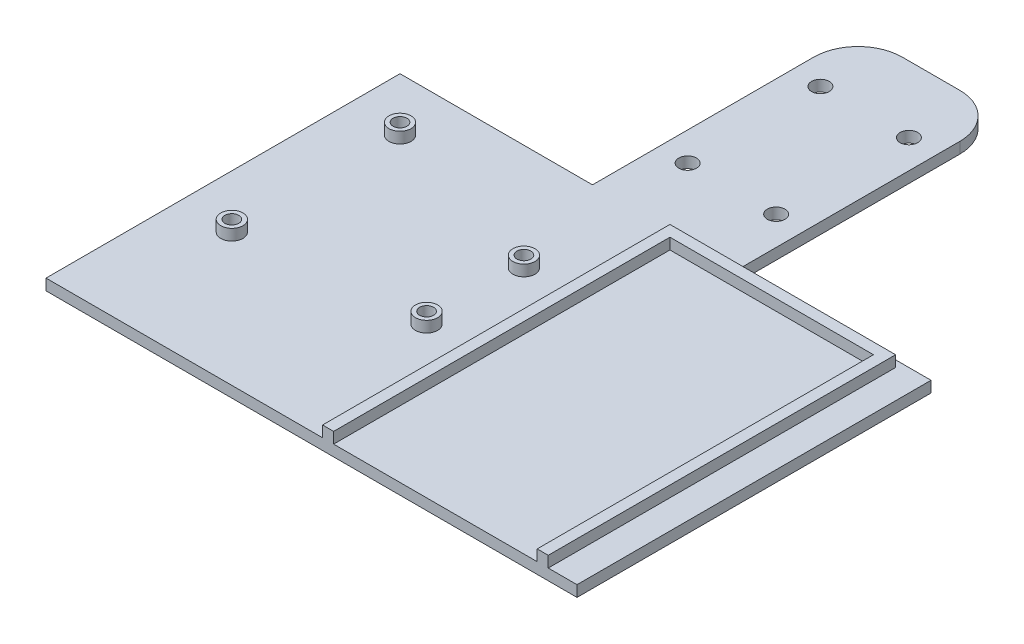
ISO-10303-21;
HEADER;
FILE_DESCRIPTION(('STEP AP214'),'2;1');
FILE_NAME('part.step','',(''),(''),'','','');
FILE_SCHEMA(('AUTOMOTIVE_DESIGN { 1 0 10303 214 1 1 1 1 }'));
ENDSEC;
DATA;
#1=APPLICATION_CONTEXT('core data for automotive mechanical design processes');
#2=APPLICATION_PROTOCOL_DEFINITION('international standard','automotive_design',2000,#1);
#3=PRODUCT_CONTEXT('',#1,'mechanical');
#4=PRODUCT('Part','Part','',(#3));
#5=PRODUCT_RELATED_PRODUCT_CATEGORY('part','',(#4));
#6=PRODUCT_DEFINITION_FORMATION('','',#4);
#7=PRODUCT_DEFINITION_CONTEXT('part definition',#1,'design');
#8=PRODUCT_DEFINITION('design','',#6,#7);
#9=PRODUCT_DEFINITION_SHAPE('','',#8);
#10=(LENGTH_UNIT() NAMED_UNIT(*) SI_UNIT(.MILLI.,.METRE.));
#11=(NAMED_UNIT(*) PLANE_ANGLE_UNIT() SI_UNIT($,.RADIAN.));
#12=(NAMED_UNIT(*) SI_UNIT($,.STERADIAN.) SOLID_ANGLE_UNIT());
#13=UNCERTAINTY_MEASURE_WITH_UNIT(LENGTH_MEASURE(1.E-05),#10,'distance_accuracy_value','');
#14=(GEOMETRIC_REPRESENTATION_CONTEXT(3) GLOBAL_UNCERTAINTY_ASSIGNED_CONTEXT((#13)) GLOBAL_UNIT_ASSIGNED_CONTEXT((#10,
#11,#12)) REPRESENTATION_CONTEXT('',''));
#15=CARTESIAN_POINT('',(0.,0.,0.));
#16=DIRECTION('',(0.,0.,1.));
#17=DIRECTION('',(1.,0.,0.));
#18=AXIS2_PLACEMENT_3D('',#15,#16,#17);
#19=CARTESIAN_POINT('',(0.,3.175,0.));
#20=DIRECTION('',(0.,-1.,0.));
#21=DIRECTION('',(0.,0.,-1.));
#22=AXIS2_PLACEMENT_3D('',#19,#20,#21);
#23=PLANE('',#22);
#24=CARTESIAN_POINT('',(-60.96,3.175,101.6));
#25=DIRECTION('',(0.,-1.,0.));
#26=DIRECTION('',(0.,0.,-1.));
#27=AXIS2_PLACEMENT_3D('',#24,#25,#26);
#28=CIRCLE('',#27,3.175);
#29=CARTESIAN_POINT('',(-60.96,3.175,98.425));
#30=VERTEX_POINT('',#29);
#31=EDGE_CURVE('E395',#30,#30,#28,.F.);
#32=ORIENTED_EDGE('',*,*,#31,.F.);
#33=EDGE_LOOP('',(#32));
#34=FACE_BOUND('',#33,.T.);
#35=CARTESIAN_POINT('',(-10.16,3.175,68.58));
#36=DIRECTION('',(0.,-1.,0.));
#37=DIRECTION('',(0.,0.,-1.));
#38=AXIS2_PLACEMENT_3D('',#35,#36,#37);
#39=CIRCLE('',#38,3.175);
#40=CARTESIAN_POINT('',(-10.16,3.175,65.405));
#41=VERTEX_POINT('',#40);
#42=EDGE_CURVE('E387',#41,#41,#39,.F.);
#43=ORIENTED_EDGE('',*,*,#42,.F.);
#44=EDGE_LOOP('',(#43));
#45=FACE_BOUND('',#44,.T.);
#46=CARTESIAN_POINT('',(12.7,3.175,-19.05));
#47=DIRECTION('',(0.,1.,0.));
#48=DIRECTION('',(0.,0.,1.));
#49=AXIS2_PLACEMENT_3D('',#46,#47,#48);
#50=CIRCLE('',#49,2.54);
#51=CARTESIAN_POINT('',(12.7,3.175,-16.51));
#52=VERTEX_POINT('',#51);
#53=EDGE_CURVE('E331',#52,#52,#50,.T.);
#54=ORIENTED_EDGE('',*,*,#53,.F.);
#55=EDGE_LOOP('',(#54));
#56=FACE_BOUND('',#55,.T.);
#57=CARTESIAN_POINT('',(12.7,3.175,19.05));
#58=DIRECTION('',(0.,1.,0.));
#59=DIRECTION('',(0.,0.,1.));
#60=AXIS2_PLACEMENT_3D('',#57,#58,#59);
#61=CIRCLE('',#60,2.54);
#62=CARTESIAN_POINT('',(12.7,3.175,21.59));
#63=VERTEX_POINT('',#62);
#64=EDGE_CURVE('E339',#63,#63,#61,.T.);
#65=ORIENTED_EDGE('',*,*,#64,.F.);
#66=EDGE_LOOP('',(#65));
#67=FACE_BOUND('',#66,.T.);
#68=CARTESIAN_POINT('',(-12.7,3.175,19.05));
#69=DIRECTION('',(0.,1.,0.));
#70=DIRECTION('',(0.,0.,1.));
#71=AXIS2_PLACEMENT_3D('',#68,#69,#70);
#72=CIRCLE('',#71,2.54);
#73=CARTESIAN_POINT('',(-12.7,3.175,21.59));
#74=VERTEX_POINT('',#73);
#75=EDGE_CURVE('E347',#74,#74,#72,.T.);
#76=ORIENTED_EDGE('',*,*,#75,.F.);
#77=EDGE_LOOP('',(#76));
#78=FACE_BOUND('',#77,.T.);
#79=CARTESIAN_POINT('',(-12.7,3.175,-19.05));
#80=DIRECTION('',(0.,1.,0.));
#81=DIRECTION('',(0.,0.,1.));
#82=AXIS2_PLACEMENT_3D('',#79,#80,#81);
#83=CIRCLE('',#82,2.54);
#84=CARTESIAN_POINT('',(-12.7,3.175,-16.51));
#85=VERTEX_POINT('',#84);
#86=EDGE_CURVE('E355',#85,#85,#83,.T.);
#87=ORIENTED_EDGE('',*,*,#86,.F.);
#88=EDGE_LOOP('',(#87));
#89=FACE_BOUND('',#88,.T.);
#90=DIRECTION('',(-1.,0.,0.));
#91=VECTOR('',#90,1.);
#92=CARTESIAN_POINT('',(-20.955,3.175,-38.1));
#93=LINE('',#92,#91);
#94=CARTESIAN_POINT('',(8.255,3.175,-38.1));
#95=VERTEX_POINT('',#94);
#96=CARTESIAN_POINT('',(-8.255,3.175,-38.1));
#97=VERTEX_POINT('',#96);
#98=EDGE_CURVE('E366',#95,#97,#93,.T.);
#99=ORIENTED_EDGE('',*,*,#98,.T.);
#100=CARTESIAN_POINT('',(-8.255,3.175,-25.4));
#101=DIRECTION('',(0.,-1.,0.));
#102=DIRECTION('',(0.,0.,-1.));
#103=AXIS2_PLACEMENT_3D('',#100,#101,#102);
#104=CIRCLE('',#103,12.7);
#105=CARTESIAN_POINT('',(-20.955,3.175,-25.4));
#106=VERTEX_POINT('',#105);
#107=EDGE_CURVE('E54',#97,#106,#104,.F.);
#108=ORIENTED_EDGE('',*,*,#107,.T.);
#109=DIRECTION('',(0.,0.,1.));
#110=VECTOR('',#109,1.);
#111=CARTESIAN_POINT('',(-20.955,3.175,38.1));
#112=LINE('',#111,#110);
#113=CARTESIAN_POINT('',(-20.955,3.175,38.1));
#114=VERTEX_POINT('',#113);
#115=EDGE_CURVE('E370',#106,#114,#112,.T.);
#116=ORIENTED_EDGE('',*,*,#115,.T.);
#117=DIRECTION('',(-1.,0.,0.));
#118=VECTOR('',#117,1.);
#119=CARTESIAN_POINT('',(-76.2,3.175,38.1));
#120=LINE('',#119,#118);
#121=CARTESIAN_POINT('',(-76.2,3.175,38.1));
#122=VERTEX_POINT('',#121);
#123=EDGE_CURVE('E296',#114,#122,#120,.T.);
#124=ORIENTED_EDGE('',*,*,#123,.T.);
#125=DIRECTION('',(0.,0.,1.));
#126=VECTOR('',#125,1.);
#127=CARTESIAN_POINT('',(-76.2,3.175,139.7));
#128=LINE('',#127,#126);
#129=CARTESIAN_POINT('',(-76.2,3.175,139.7));
#130=VERTEX_POINT('',#129);
#131=EDGE_CURVE('E288',#122,#130,#128,.T.);
#132=ORIENTED_EDGE('',*,*,#131,.T.);
#133=DIRECTION('',(1.,0.,0.));
#134=VECTOR('',#133,1.);
#135=CARTESIAN_POINT('',(-76.2,3.175,139.7));
#136=LINE('',#135,#134);
#137=CARTESIAN_POINT('',(3.17499999999998,3.175,139.7));
#138=VERTEX_POINT('',#137);
#139=EDGE_CURVE('E282',#130,#138,#136,.T.);
#140=ORIENTED_EDGE('',*,*,#139,.T.);
#141=DIRECTION('',(0.,0.,1.));
#142=VECTOR('',#141,1.);
#143=CARTESIAN_POINT('',(3.17500000000002,3.175,120.65));
#144=LINE('',#143,#142);
#145=CARTESIAN_POINT('',(3.17500000000001,3.175,40.005));
#146=VERTEX_POINT('',#145);
#147=EDGE_CURVE('E183',#146,#138,#144,.T.);
#148=ORIENTED_EDGE('',*,*,#147,.F.);
#149=DIRECTION('',(-1.,0.,0.));
#150=VECTOR('',#149,1.);
#151=CARTESIAN_POINT('',(3.17500000000001,3.175,40.005));
#152=LINE('',#151,#150);
#153=CARTESIAN_POINT('',(67.945,3.175,40.005));
#154=VERTEX_POINT('',#153);
#155=EDGE_CURVE('E235',#154,#146,#152,.T.);
#156=ORIENTED_EDGE('',*,*,#155,.F.);
#157=DIRECTION('',(0.,0.,-1.));
#158=VECTOR('',#157,1.);
#159=CARTESIAN_POINT('',(67.945,3.175,40.005));
#160=LINE('',#159,#158);
#161=CARTESIAN_POINT('',(67.945,3.175,139.7));
#162=VERTEX_POINT('',#161);
#163=EDGE_CURVE('E231',#162,#154,#160,.T.);
#164=ORIENTED_EDGE('',*,*,#163,.F.);
#165=CARTESIAN_POINT('',(76.2,3.175,139.7));
#166=VERTEX_POINT('',#165);
#167=EDGE_CURVE('E287',#162,#166,#136,.T.);
#168=ORIENTED_EDGE('',*,*,#167,.T.);
#169=DIRECTION('',(0.,0.,-1.));
#170=VECTOR('',#169,1.);
#171=CARTESIAN_POINT('',(76.2,3.175,139.7));
#172=LINE('',#171,#170);
#173=CARTESIAN_POINT('',(76.2,3.175,38.1));
#174=VERTEX_POINT('',#173);
#175=EDGE_CURVE('E270',#166,#174,#172,.T.);
#176=ORIENTED_EDGE('',*,*,#175,.T.);
#177=CARTESIAN_POINT('',(20.955,3.175,38.1));
#178=VERTEX_POINT('',#177);
#179=EDGE_CURVE('E292',#174,#178,#120,.T.);
#180=ORIENTED_EDGE('',*,*,#179,.T.);
#181=DIRECTION('',(0.,0.,-1.));
#182=VECTOR('',#181,1.);
#183=CARTESIAN_POINT('',(20.955,3.175,38.1));
#184=LINE('',#183,#182);
#185=CARTESIAN_POINT('',(20.955,3.175,-25.4));
#186=VERTEX_POINT('',#185);
#187=EDGE_CURVE('E363',#178,#186,#184,.T.);
#188=ORIENTED_EDGE('',*,*,#187,.T.);
#189=CARTESIAN_POINT('',(8.255,3.175,-25.4));
#190=DIRECTION('',(0.,-1.,0.));
#191=DIRECTION('',(0.,0.,-1.));
#192=AXIS2_PLACEMENT_3D('',#189,#190,#191);
#193=CIRCLE('',#192,12.7);
#194=EDGE_CURVE('E419',#186,#95,#193,.F.);
#195=ORIENTED_EDGE('',*,*,#194,.T.);
#196=EDGE_LOOP('',(#99,#108,#116,#124,#132,#140,#148,#156,#164,#168,#176,#180,#188,#195));
#197=FACE_BOUND('',#196,.T.);
#198=CARTESIAN_POINT('',(-10.16,3.175,96.52));
#199=DIRECTION('',(0.,-1.,0.));
#200=DIRECTION('',(0.,0.,-1.));
#201=AXIS2_PLACEMENT_3D('',#198,#199,#200);
#202=CIRCLE('',#201,3.175);
#203=CARTESIAN_POINT('',(-10.16,3.175,93.345));
#204=VERTEX_POINT('',#203);
#205=EDGE_CURVE('E391',#204,#204,#202,.F.);
#206=ORIENTED_EDGE('',*,*,#205,.F.);
#207=EDGE_LOOP('',(#206));
#208=FACE_BOUND('',#207,.T.);
#209=CARTESIAN_POINT('',(-60.96,3.175,53.34));
#210=DIRECTION('',(0.,-1.,0.));
#211=DIRECTION('',(0.,0.,-1.));
#212=AXIS2_PLACEMENT_3D('',#209,#210,#211);
#213=CIRCLE('',#212,3.175);
#214=CARTESIAN_POINT('',(-60.96,3.175,50.165));
#215=VERTEX_POINT('',#214);
#216=EDGE_CURVE('E399',#215,#215,#213,.F.);
#217=ORIENTED_EDGE('',*,*,#216,.F.);
#218=EDGE_LOOP('',(#217));
#219=FACE_BOUND('',#218,.T.);
#220=ADVANCED_FACE('F45',(#34,#45,#56,#67,#78,#89,#197,#208,#219),#23,.F.);
#221=DIRECTION('',(0.,0.,-1.));
#222=VECTOR('',#221,1.);
#223=CARTESIAN_POINT('',(6.35000000000001,3.175,43.18));
#224=LINE('',#223,#222);
#225=CARTESIAN_POINT('',(6.34999999999998,3.175,139.7));
#226=VERTEX_POINT('',#225);
#227=CARTESIAN_POINT('',(6.35000000000001,3.175,43.18));
#228=VERTEX_POINT('',#227);
#229=EDGE_CURVE('E189',#226,#228,#224,.T.);
#230=ORIENTED_EDGE('',*,*,#229,.F.);
#231=CARTESIAN_POINT('',(64.7699999999999,3.175,139.7));
#232=VERTEX_POINT('',#231);
#233=EDGE_CURVE('E286',#226,#232,#136,.T.);
#234=ORIENTED_EDGE('',*,*,#233,.T.);
#235=DIRECTION('',(0.,0.,1.));
#236=VECTOR('',#235,1.);
#237=CARTESIAN_POINT('',(64.77,3.175,120.65));
#238=LINE('',#237,#236);
#239=CARTESIAN_POINT('',(64.77,3.175,43.18));
#240=VERTEX_POINT('',#239);
#241=EDGE_CURVE('E227',#240,#232,#238,.T.);
#242=ORIENTED_EDGE('',*,*,#241,.F.);
#243=DIRECTION('',(1.,0.,0.));
#244=VECTOR('',#243,1.);
#245=CARTESIAN_POINT('',(6.35000000000001,3.175,43.18));
#246=LINE('',#245,#244);
#247=EDGE_CURVE('E223',#228,#240,#246,.T.);
#248=ORIENTED_EDGE('',*,*,#247,.F.);
#249=EDGE_LOOP('',(#230,#234,#242,#248));
#250=FACE_BOUND('',#249,.T.);
#251=ADVANCED_FACE('F479',(#250),#23,.F.);
#252=CARTESIAN_POINT('',(0.,0.,0.));
#253=DIRECTION('',(0.,-1.,0.));
#254=DIRECTION('',(0.,0.,-1.));
#255=AXIS2_PLACEMENT_3D('',#252,#253,#254);
#256=PLANE('',#255);
#257=CARTESIAN_POINT('',(-60.96,0.,53.34));
#258=DIRECTION('',(0.,1.,0.));
#259=DIRECTION('',(0.,0.,1.));
#260=AXIS2_PLACEMENT_3D('',#257,#258,#259);
#261=CIRCLE('',#260,2.00000000000001);
#262=CARTESIAN_POINT('',(-60.96,0.,55.34));
#263=VERTEX_POINT('',#262);
#264=EDGE_CURVE('E266',#263,#263,#261,.T.);
#265=ORIENTED_EDGE('',*,*,#264,.T.);
#266=EDGE_LOOP('',(#265));
#267=FACE_BOUND('',#266,.T.);
#268=CARTESIAN_POINT('',(-60.96,0.,101.6));
#269=DIRECTION('',(0.,1.,0.));
#270=DIRECTION('',(0.,0.,1.));
#271=AXIS2_PLACEMENT_3D('',#268,#269,#270);
#272=CIRCLE('',#271,2.00000000000001);
#273=CARTESIAN_POINT('',(-60.96,0.,103.6));
#274=VERTEX_POINT('',#273);
#275=EDGE_CURVE('E271',#274,#274,#272,.T.);
#276=ORIENTED_EDGE('',*,*,#275,.T.);
#277=EDGE_LOOP('',(#276));
#278=FACE_BOUND('',#277,.T.);
#279=CARTESIAN_POINT('',(-10.16,0.,96.52));
#280=DIRECTION('',(0.,1.,0.));
#281=DIRECTION('',(0.,0.,1.));
#282=AXIS2_PLACEMENT_3D('',#279,#280,#281);
#283=CIRCLE('',#282,2.);
#284=CARTESIAN_POINT('',(-10.16,0.,98.52));
#285=VERTEX_POINT('',#284);
#286=EDGE_CURVE('E275',#285,#285,#283,.T.);
#287=ORIENTED_EDGE('',*,*,#286,.T.);
#288=EDGE_LOOP('',(#287));
#289=FACE_BOUND('',#288,.T.);
#290=CARTESIAN_POINT('',(-10.16,0.,68.58));
#291=DIRECTION('',(0.,1.,0.));
#292=DIRECTION('',(0.,0.,1.));
#293=AXIS2_PLACEMENT_3D('',#290,#291,#292);
#294=CIRCLE('',#293,2.);
#295=CARTESIAN_POINT('',(-10.16,0.,70.58));
#296=VERTEX_POINT('',#295);
#297=EDGE_CURVE('E193',#296,#296,#294,.T.);
#298=ORIENTED_EDGE('',*,*,#297,.T.);
#299=EDGE_LOOP('',(#298));
#300=FACE_BOUND('',#299,.T.);
#301=CARTESIAN_POINT('',(12.7,0.,19.05));
#302=DIRECTION('',(0.,1.,0.));
#303=DIRECTION('',(0.,0.,1.));
#304=AXIS2_PLACEMENT_3D('',#301,#302,#303);
#305=CIRCLE('',#304,2.54);
#306=CARTESIAN_POINT('',(12.7,0.,21.59));
#307=VERTEX_POINT('',#306);
#308=EDGE_CURVE('E335',#307,#307,#305,.T.);
#309=ORIENTED_EDGE('',*,*,#308,.T.);
#310=EDGE_LOOP('',(#309));
#311=FACE_BOUND('',#310,.T.);
#312=CARTESIAN_POINT('',(-12.7,0.,-19.05));
#313=DIRECTION('',(0.,1.,0.));
#314=DIRECTION('',(0.,0.,1.));
#315=AXIS2_PLACEMENT_3D('',#312,#313,#314);
#316=CIRCLE('',#315,2.54);
#317=CARTESIAN_POINT('',(-12.7,0.,-16.51));
#318=VERTEX_POINT('',#317);
#319=EDGE_CURVE('E351',#318,#318,#316,.T.);
#320=ORIENTED_EDGE('',*,*,#319,.T.);
#321=EDGE_LOOP('',(#320));
#322=FACE_BOUND('',#321,.T.);
#323=DIRECTION('',(0.,0.,1.));
#324=VECTOR('',#323,1.);
#325=CARTESIAN_POINT('',(-20.955,0.,38.1));
#326=LINE('',#325,#324);
#327=CARTESIAN_POINT('',(-20.955,0.,-25.4));
#328=VERTEX_POINT('',#327);
#329=CARTESIAN_POINT('',(-20.955,0.,38.1));
#330=VERTEX_POINT('',#329);
#331=EDGE_CURVE('E367',#328,#330,#326,.T.);
#332=ORIENTED_EDGE('',*,*,#331,.F.);
#333=CARTESIAN_POINT('',(-8.255,0.,-25.4));
#334=DIRECTION('',(0.,-1.,0.));
#335=DIRECTION('',(0.,0.,-1.));
#336=AXIS2_PLACEMENT_3D('',#333,#334,#335);
#337=CIRCLE('',#336,12.7);
#338=CARTESIAN_POINT('',(-8.255,0.,-38.1));
#339=VERTEX_POINT('',#338);
#340=EDGE_CURVE('E410',#328,#339,#337,.T.);
#341=ORIENTED_EDGE('',*,*,#340,.T.);
#342=DIRECTION('',(-1.,0.,0.));
#343=VECTOR('',#342,1.);
#344=CARTESIAN_POINT('',(-20.955,0.,-38.1));
#345=LINE('',#344,#343);
#346=CARTESIAN_POINT('',(8.255,0.,-38.1));
#347=VERTEX_POINT('',#346);
#348=EDGE_CURVE('E376',#347,#339,#345,.T.);
#349=ORIENTED_EDGE('',*,*,#348,.F.);
#350=CARTESIAN_POINT('',(8.255,0.,-25.4));
#351=DIRECTION('',(0.,-1.,0.));
#352=DIRECTION('',(0.,0.,-1.));
#353=AXIS2_PLACEMENT_3D('',#350,#351,#352);
#354=CIRCLE('',#353,12.7);
#355=CARTESIAN_POINT('',(20.955,0.,-25.4));
#356=VERTEX_POINT('',#355);
#357=EDGE_CURVE('E407',#347,#356,#354,.T.);
#358=ORIENTED_EDGE('',*,*,#357,.T.);
#359=DIRECTION('',(0.,0.,-1.));
#360=VECTOR('',#359,1.);
#361=CARTESIAN_POINT('',(20.955,0.,38.1));
#362=LINE('',#361,#360);
#363=CARTESIAN_POINT('',(20.955,0.,38.1));
#364=VERTEX_POINT('',#363);
#365=EDGE_CURVE('E359',#364,#356,#362,.T.);
#366=ORIENTED_EDGE('',*,*,#365,.F.);
#367=DIRECTION('',(-1.,0.,0.));
#368=VECTOR('',#367,1.);
#369=CARTESIAN_POINT('',(-76.2,0.,38.1));
#370=LINE('',#369,#368);
#371=CARTESIAN_POINT('',(76.2,0.,38.1));
#372=VERTEX_POINT('',#371);
#373=EDGE_CURVE('E300',#372,#364,#370,.T.);
#374=ORIENTED_EDGE('',*,*,#373,.F.);
#375=DIRECTION('',(0.,0.,-1.));
#376=VECTOR('',#375,1.);
#377=CARTESIAN_POINT('',(76.2,0.,139.7));
#378=LINE('',#377,#376);
#379=CARTESIAN_POINT('',(76.2,0.,139.7));
#380=VERTEX_POINT('',#379);
#381=EDGE_CURVE('E305',#380,#372,#378,.T.);
#382=ORIENTED_EDGE('',*,*,#381,.F.);
#383=DIRECTION('',(1.,0.,0.));
#384=VECTOR('',#383,1.);
#385=CARTESIAN_POINT('',(-76.2,0.,139.7));
#386=LINE('',#385,#384);
#387=CARTESIAN_POINT('',(-76.2,0.,139.7));
#388=VERTEX_POINT('',#387);
#389=EDGE_CURVE('E311',#388,#380,#386,.T.);
#390=ORIENTED_EDGE('',*,*,#389,.F.);
#391=DIRECTION('',(0.,0.,1.));
#392=VECTOR('',#391,1.);
#393=CARTESIAN_POINT('',(-76.2,0.,139.7));
#394=LINE('',#393,#392);
#395=CARTESIAN_POINT('',(-76.2,0.,38.1));
#396=VERTEX_POINT('',#395);
#397=EDGE_CURVE('E316',#396,#388,#394,.T.);
#398=ORIENTED_EDGE('',*,*,#397,.F.);
#399=EDGE_CURVE('E285',#330,#396,#370,.T.);
#400=ORIENTED_EDGE('',*,*,#399,.F.);
#401=EDGE_LOOP('',(#332,#341,#349,#358,#366,#374,#382,#390,#398,#400));
#402=FACE_BOUND('',#401,.T.);
#403=CARTESIAN_POINT('',(-12.7,0.,19.05));
#404=DIRECTION('',(0.,1.,0.));
#405=DIRECTION('',(0.,0.,1.));
#406=AXIS2_PLACEMENT_3D('',#403,#404,#405);
#407=CIRCLE('',#406,2.54);
#408=CARTESIAN_POINT('',(-12.7,0.,21.59));
#409=VERTEX_POINT('',#408);
#410=EDGE_CURVE('E343',#409,#409,#407,.T.);
#411=ORIENTED_EDGE('',*,*,#410,.T.);
#412=EDGE_LOOP('',(#411));
#413=FACE_BOUND('',#412,.T.);
#414=CARTESIAN_POINT('',(12.7,0.,-19.05));
#415=DIRECTION('',(0.,1.,0.));
#416=DIRECTION('',(0.,0.,1.));
#417=AXIS2_PLACEMENT_3D('',#414,#415,#416);
#418=CIRCLE('',#417,2.54);
#419=CARTESIAN_POINT('',(12.7,0.,-16.51));
#420=VERTEX_POINT('',#419);
#421=EDGE_CURVE('E330',#420,#420,#418,.T.);
#422=ORIENTED_EDGE('',*,*,#421,.T.);
#423=EDGE_LOOP('',(#422));
#424=FACE_BOUND('',#423,.T.);
#425=ADVANCED_FACE('F436',(#267,#278,#289,#300,#311,#322,#402,#413,#424),#256,.T.);
#426=CARTESIAN_POINT('',(20.955,3.175,38.1));
#427=DIRECTION('',(-1.,0.,0.));
#428=DIRECTION('',(0.,0.,1.));
#429=AXIS2_PLACEMENT_3D('',#426,#427,#428);
#430=PLANE('',#429);
#431=ORIENTED_EDGE('',*,*,#365,.T.);
#432=DIRECTION('',(0.,-1.,0.));
#433=VECTOR('',#432,1.);
#434=CARTESIAN_POINT('',(20.955,3.175,-25.4));
#435=LINE('',#434,#433);
#436=EDGE_CURVE('E11',#356,#186,#435,.F.);
#437=ORIENTED_EDGE('',*,*,#436,.T.);
#438=ORIENTED_EDGE('',*,*,#187,.F.);
#439=DIRECTION('',(0.,-1.,0.));
#440=VECTOR('',#439,1.);
#441=CARTESIAN_POINT('',(20.955,3.175,38.1));
#442=LINE('',#441,#440);
#443=EDGE_CURVE('E373',#178,#364,#442,.T.);
#444=ORIENTED_EDGE('',*,*,#443,.T.);
#445=EDGE_LOOP('',(#431,#437,#438,#444));
#446=FACE_BOUND('',#445,.T.);
#447=ADVANCED_FACE('F444',(#446),#430,.F.);
#448=CARTESIAN_POINT('',(-20.955,3.175,-38.1));
#449=DIRECTION('',(0.,0.,1.));
#450=DIRECTION('',(1.,0.,0.));
#451=AXIS2_PLACEMENT_3D('',#448,#449,#450);
#452=PLANE('',#451);
#453=ORIENTED_EDGE('',*,*,#348,.T.);
#454=DIRECTION('',(0.,-1.,0.));
#455=VECTOR('',#454,1.);
#456=CARTESIAN_POINT('',(-8.255,3.175,-38.1));
#457=LINE('',#456,#455);
#458=EDGE_CURVE('E67',#339,#97,#457,.F.);
#459=ORIENTED_EDGE('',*,*,#458,.T.);
#460=ORIENTED_EDGE('',*,*,#98,.F.);
#461=DIRECTION('',(0.,-1.,0.));
#462=VECTOR('',#461,1.);
#463=CARTESIAN_POINT('',(8.255,3.175,-38.1));
#464=LINE('',#463,#462);
#465=EDGE_CURVE('E413',#95,#347,#464,.T.);
#466=ORIENTED_EDGE('',*,*,#465,.T.);
#467=EDGE_LOOP('',(#453,#459,#460,#466));
#468=FACE_BOUND('',#467,.T.);
#469=ADVANCED_FACE('F439',(#468),#452,.F.);
#470=CARTESIAN_POINT('',(-20.955,3.175,38.1));
#471=DIRECTION('',(1.,0.,0.));
#472=DIRECTION('',(0.,0.,-1.));
#473=AXIS2_PLACEMENT_3D('',#470,#471,#472);
#474=PLANE('',#473);
#475=ORIENTED_EDGE('',*,*,#115,.F.);
#476=DIRECTION('',(0.,-1.,0.));
#477=VECTOR('',#476,1.);
#478=CARTESIAN_POINT('',(-20.955,3.175,-25.4));
#479=LINE('',#478,#477);
#480=EDGE_CURVE('E403',#106,#328,#479,.T.);
#481=ORIENTED_EDGE('',*,*,#480,.T.);
#482=ORIENTED_EDGE('',*,*,#331,.T.);
#483=DIRECTION('',(0.,-1.,0.));
#484=VECTOR('',#483,1.);
#485=CARTESIAN_POINT('',(-20.955,3.175,38.1));
#486=LINE('',#485,#484);
#487=EDGE_CURVE('E383',#114,#330,#486,.T.);
#488=ORIENTED_EDGE('',*,*,#487,.F.);
#489=EDGE_LOOP('',(#475,#481,#482,#488));
#490=FACE_BOUND('',#489,.T.);
#491=ADVANCED_FACE('F430',(#490),#474,.F.);
#492=CARTESIAN_POINT('',(-12.7,3.175,-19.05));
#493=DIRECTION('',(0.,-1.,0.));
#494=DIRECTION('',(0.,0.,-1.));
#495=AXIS2_PLACEMENT_3D('',#492,#493,#494);
#496=CYLINDRICAL_SURFACE('',#495,2.54);
#497=ORIENTED_EDGE('',*,*,#86,.T.);
#498=EDGE_LOOP('',(#497));
#499=FACE_BOUND('',#498,.T.);
#500=ORIENTED_EDGE('',*,*,#319,.F.);
#501=EDGE_LOOP('',(#500));
#502=FACE_BOUND('',#501,.T.);
#503=ADVANCED_FACE('F510',(#499,#502),#496,.F.);
#504=CARTESIAN_POINT('',(-12.7,3.175,19.05));
#505=DIRECTION('',(0.,-1.,0.));
#506=DIRECTION('',(0.,0.,-1.));
#507=AXIS2_PLACEMENT_3D('',#504,#505,#506);
#508=CYLINDRICAL_SURFACE('',#507,2.54);
#509=ORIENTED_EDGE('',*,*,#75,.T.);
#510=EDGE_LOOP('',(#509));
#511=FACE_BOUND('',#510,.T.);
#512=ORIENTED_EDGE('',*,*,#410,.F.);
#513=EDGE_LOOP('',(#512));
#514=FACE_BOUND('',#513,.T.);
#515=ADVANCED_FACE('F625',(#511,#514),#508,.F.);
#516=CARTESIAN_POINT('',(12.7,3.175,19.05));
#517=DIRECTION('',(0.,-1.,0.));
#518=DIRECTION('',(0.,0.,-1.));
#519=AXIS2_PLACEMENT_3D('',#516,#517,#518);
#520=CYLINDRICAL_SURFACE('',#519,2.54);
#521=ORIENTED_EDGE('',*,*,#64,.T.);
#522=EDGE_LOOP('',(#521));
#523=FACE_BOUND('',#522,.T.);
#524=ORIENTED_EDGE('',*,*,#308,.F.);
#525=EDGE_LOOP('',(#524));
#526=FACE_BOUND('',#525,.T.);
#527=ADVANCED_FACE('F622',(#523,#526),#520,.F.);
#528=CARTESIAN_POINT('',(12.7,3.175,-19.05));
#529=DIRECTION('',(0.,-1.,0.));
#530=DIRECTION('',(0.,0.,-1.));
#531=AXIS2_PLACEMENT_3D('',#528,#529,#530);
#532=CYLINDRICAL_SURFACE('',#531,2.54);
#533=ORIENTED_EDGE('',*,*,#53,.T.);
#534=EDGE_LOOP('',(#533));
#535=FACE_BOUND('',#534,.T.);
#536=ORIENTED_EDGE('',*,*,#421,.F.);
#537=EDGE_LOOP('',(#536));
#538=FACE_BOUND('',#537,.T.);
#539=ADVANCED_FACE('F619',(#535,#538),#532,.F.);
#540=CARTESIAN_POINT('',(-76.2,-183.162004793571,38.1));
#541=DIRECTION('',(0.,0.,-1.));
#542=DIRECTION('',(-1.,0.,0.));
#543=AXIS2_PLACEMENT_3D('',#540,#541,#542);
#544=PLANE('',#543);
#545=ORIENTED_EDGE('',*,*,#443,.F.);
#546=ORIENTED_EDGE('',*,*,#179,.F.);
#547=DIRECTION('',(0.,1.,0.));
#548=VECTOR('',#547,1.);
#549=CARTESIAN_POINT('',(76.2,-183.162004793571,38.1));
#550=LINE('',#549,#548);
#551=EDGE_CURVE('E309',#372,#174,#550,.T.);
#552=ORIENTED_EDGE('',*,*,#551,.F.);
#553=ORIENTED_EDGE('',*,*,#373,.T.);
#554=EDGE_LOOP('',(#545,#546,#552,#553));
#555=FACE_BOUND('',#554,.T.);
#556=ADVANCED_FACE('F448',(#555),#544,.T.);
#557=ORIENTED_EDGE('',*,*,#123,.F.);
#558=ORIENTED_EDGE('',*,*,#487,.T.);
#559=ORIENTED_EDGE('',*,*,#399,.T.);
#560=DIRECTION('',(0.,1.,0.));
#561=VECTOR('',#560,1.);
#562=CARTESIAN_POINT('',(-76.2,-183.162004793571,38.1));
#563=LINE('',#562,#561);
#564=EDGE_CURVE('E304',#396,#122,#563,.T.);
#565=ORIENTED_EDGE('',*,*,#564,.T.);
#566=EDGE_LOOP('',(#557,#558,#559,#565));
#567=FACE_BOUND('',#566,.T.);
#568=ADVANCED_FACE('F465',(#567),#544,.T.);
#569=CARTESIAN_POINT('',(-76.2,-183.162004793571,139.7));
#570=DIRECTION('',(-1.,0.,0.));
#571=DIRECTION('',(0.,0.,1.));
#572=AXIS2_PLACEMENT_3D('',#569,#570,#571);
#573=PLANE('',#572);
#574=ORIENTED_EDGE('',*,*,#564,.F.);
#575=ORIENTED_EDGE('',*,*,#397,.T.);
#576=DIRECTION('',(0.,1.,0.));
#577=VECTOR('',#576,1.);
#578=CARTESIAN_POINT('',(-76.2,-183.162004793571,139.7));
#579=LINE('',#578,#577);
#580=EDGE_CURVE('E315',#388,#130,#579,.T.);
#581=ORIENTED_EDGE('',*,*,#580,.T.);
#582=ORIENTED_EDGE('',*,*,#131,.F.);
#583=EDGE_LOOP('',(#574,#575,#581,#582));
#584=FACE_BOUND('',#583,.T.);
#585=ADVANCED_FACE('F463',(#584),#573,.T.);
#586=CARTESIAN_POINT('',(-76.2,-183.162004793571,139.7));
#587=DIRECTION('',(0.,0.,1.));
#588=DIRECTION('',(1.,0.,0.));
#589=AXIS2_PLACEMENT_3D('',#586,#587,#588);
#590=PLANE('',#589);
#591=ORIENTED_EDGE('',*,*,#580,.F.);
#592=ORIENTED_EDGE('',*,*,#389,.T.);
#593=DIRECTION('',(0.,1.,0.));
#594=VECTOR('',#593,1.);
#595=CARTESIAN_POINT('',(76.2,-183.162004793571,139.7));
#596=LINE('',#595,#594);
#597=EDGE_CURVE('E310',#380,#166,#596,.T.);
#598=ORIENTED_EDGE('',*,*,#597,.T.);
#599=ORIENTED_EDGE('',*,*,#167,.F.);
#600=DIRECTION('',(0.,-1.,0.));
#601=VECTOR('',#600,1.);
#602=CARTESIAN_POINT('',(67.945,6.35,139.7));
#603=LINE('',#602,#601);
#604=CARTESIAN_POINT('',(67.945,6.35,139.7));
#605=VERTEX_POINT('',#604);
#606=EDGE_CURVE('E256',#605,#162,#603,.T.);
#607=ORIENTED_EDGE('',*,*,#606,.F.);
#608=DIRECTION('',(1.,0.,0.));
#609=VECTOR('',#608,1.);
#610=CARTESIAN_POINT('',(64.77,6.35,139.7));
#611=LINE('',#610,#609);
#612=CARTESIAN_POINT('',(64.77,6.35,139.7));
#613=VERTEX_POINT('',#612);
#614=EDGE_CURVE('E203',#613,#605,#611,.T.);
#615=ORIENTED_EDGE('',*,*,#614,.F.);
#616=DIRECTION('',(0.,-1.,0.));
#617=VECTOR('',#616,1.);
#618=CARTESIAN_POINT('',(64.77,6.35,139.7));
#619=LINE('',#618,#617);
#620=EDGE_CURVE('E260',#613,#232,#619,.T.);
#621=ORIENTED_EDGE('',*,*,#620,.T.);
#622=ORIENTED_EDGE('',*,*,#233,.F.);
#623=DIRECTION('',(0.,-1.,0.));
#624=VECTOR('',#623,1.);
#625=CARTESIAN_POINT('',(6.35000000000001,6.35,139.7));
#626=LINE('',#625,#624);
#627=CARTESIAN_POINT('',(6.35000000000001,6.35,139.7));
#628=VERTEX_POINT('',#627);
#629=EDGE_CURVE('E220',#628,#226,#626,.T.);
#630=ORIENTED_EDGE('',*,*,#629,.F.);
#631=DIRECTION('',(1.,0.,0.));
#632=VECTOR('',#631,1.);
#633=CARTESIAN_POINT('',(3.175,6.35,139.7));
#634=LINE('',#633,#632);
#635=CARTESIAN_POINT('',(3.175,6.35,139.7));
#636=VERTEX_POINT('',#635);
#637=EDGE_CURVE('E178',#636,#628,#634,.T.);
#638=ORIENTED_EDGE('',*,*,#637,.F.);
#639=DIRECTION('',(0.,-1.,0.));
#640=VECTOR('',#639,1.);
#641=CARTESIAN_POINT('',(3.175,6.35,139.7));
#642=LINE('',#641,#640);
#643=EDGE_CURVE('E244',#636,#138,#642,.T.);
#644=ORIENTED_EDGE('',*,*,#643,.T.);
#645=ORIENTED_EDGE('',*,*,#139,.F.);
#646=EDGE_LOOP('',(#591,#592,#598,#599,#607,#615,#621,#622,#630,#638,#644,#645));
#647=FACE_BOUND('',#646,.T.);
#648=ADVANCED_FACE('F460',(#647),#590,.T.);
#649=CARTESIAN_POINT('',(76.2,-183.162004793571,139.7));
#650=DIRECTION('',(1.,0.,0.));
#651=DIRECTION('',(0.,0.,-1.));
#652=AXIS2_PLACEMENT_3D('',#649,#650,#651);
#653=PLANE('',#652);
#654=ORIENTED_EDGE('',*,*,#597,.F.);
#655=ORIENTED_EDGE('',*,*,#381,.T.);
#656=ORIENTED_EDGE('',*,*,#551,.T.);
#657=ORIENTED_EDGE('',*,*,#175,.F.);
#658=EDGE_LOOP('',(#654,#655,#656,#657));
#659=FACE_BOUND('',#658,.T.);
#660=ADVANCED_FACE('F454',(#659),#653,.T.);
#661=CARTESIAN_POINT('',(-10.16,0.,68.58));
#662=DIRECTION('',(0.,1.,0.));
#663=DIRECTION('',(0.,0.,1.));
#664=AXIS2_PLACEMENT_3D('',#661,#662,#663);
#665=CYLINDRICAL_SURFACE('',#664,2.);
#666=ORIENTED_EDGE('',*,*,#297,.F.);
#667=EDGE_LOOP('',(#666));
#668=FACE_BOUND('',#667,.T.);
#669=CARTESIAN_POINT('',(-10.16,6.35,68.58));
#670=DIRECTION('',(0.,1.,0.));
#671=DIRECTION('',(0.,0.,1.));
#672=AXIS2_PLACEMENT_3D('',#669,#670,#671);
#673=CIRCLE('',#672,2.00000000000001);
#674=CARTESIAN_POINT('',(-10.16,6.35,70.58));
#675=VERTEX_POINT('',#674);
#676=EDGE_CURVE('E580',#675,#675,#673,.T.);
#677=ORIENTED_EDGE('',*,*,#676,.T.);
#678=EDGE_LOOP('',(#677));
#679=FACE_BOUND('',#678,.T.);
#680=ADVANCED_FACE('F598',(#668,#679),#665,.F.);
#681=CARTESIAN_POINT('',(-10.16,0.,96.52));
#682=DIRECTION('',(0.,1.,0.));
#683=DIRECTION('',(0.,0.,1.));
#684=AXIS2_PLACEMENT_3D('',#681,#682,#683);
#685=CYLINDRICAL_SURFACE('',#684,2.);
#686=ORIENTED_EDGE('',*,*,#286,.F.);
#687=EDGE_LOOP('',(#686));
#688=FACE_BOUND('',#687,.T.);
#689=CARTESIAN_POINT('',(-10.16,6.35,96.52));
#690=DIRECTION('',(0.,1.,0.));
#691=DIRECTION('',(0.,0.,1.));
#692=AXIS2_PLACEMENT_3D('',#689,#690,#691);
#693=CIRCLE('',#692,2.00000000000001);
#694=CARTESIAN_POINT('',(-10.16,6.35,98.52));
#695=VERTEX_POINT('',#694);
#696=EDGE_CURVE('E579',#695,#695,#693,.T.);
#697=ORIENTED_EDGE('',*,*,#696,.T.);
#698=EDGE_LOOP('',(#697));
#699=FACE_BOUND('',#698,.T.);
#700=ADVANCED_FACE('F599',(#688,#699),#685,.F.);
#701=CARTESIAN_POINT('',(-60.96,0.,101.6));
#702=DIRECTION('',(0.,1.,0.));
#703=DIRECTION('',(0.,0.,1.));
#704=AXIS2_PLACEMENT_3D('',#701,#702,#703);
#705=CYLINDRICAL_SURFACE('',#704,2.00000000000001);
#706=ORIENTED_EDGE('',*,*,#275,.F.);
#707=EDGE_LOOP('',(#706));
#708=FACE_BOUND('',#707,.T.);
#709=CARTESIAN_POINT('',(-60.96,6.35,101.6));
#710=DIRECTION('',(0.,1.,0.));
#711=DIRECTION('',(0.,0.,1.));
#712=AXIS2_PLACEMENT_3D('',#709,#710,#711);
#713=CIRCLE('',#712,2.00000000000001);
#714=CARTESIAN_POINT('',(-60.96,6.35,103.6));
#715=VERTEX_POINT('',#714);
#716=EDGE_CURVE('E590',#715,#715,#713,.T.);
#717=ORIENTED_EDGE('',*,*,#716,.T.);
#718=EDGE_LOOP('',(#717));
#719=FACE_BOUND('',#718,.T.);
#720=ADVANCED_FACE('F605',(#708,#719),#705,.F.);
#721=CARTESIAN_POINT('',(-60.96,0.,53.34));
#722=DIRECTION('',(0.,1.,0.));
#723=DIRECTION('',(0.,0.,1.));
#724=AXIS2_PLACEMENT_3D('',#721,#722,#723);
#725=CYLINDRICAL_SURFACE('',#724,2.00000000000001);
#726=ORIENTED_EDGE('',*,*,#264,.F.);
#727=EDGE_LOOP('',(#726));
#728=FACE_BOUND('',#727,.T.);
#729=CARTESIAN_POINT('',(-60.96,6.35,53.34));
#730=DIRECTION('',(0.,1.,0.));
#731=DIRECTION('',(0.,0.,1.));
#732=AXIS2_PLACEMENT_3D('',#729,#730,#731);
#733=CIRCLE('',#732,2.00000000000001);
#734=CARTESIAN_POINT('',(-60.96,6.35,55.34));
#735=VERTEX_POINT('',#734);
#736=EDGE_CURVE('E885',#735,#735,#733,.T.);
#737=ORIENTED_EDGE('',*,*,#736,.T.);
#738=EDGE_LOOP('',(#737));
#739=FACE_BOUND('',#738,.T.);
#740=ADVANCED_FACE('F739',(#728,#739),#725,.F.);
#741=CARTESIAN_POINT('',(6.35000000000001,6.35,43.18));
#742=DIRECTION('',(-1.,0.,0.));
#743=DIRECTION('',(0.,0.,1.));
#744=AXIS2_PLACEMENT_3D('',#741,#742,#743);
#745=PLANE('',#744);
#746=ORIENTED_EDGE('',*,*,#229,.T.);
#747=DIRECTION('',(0.,-1.,0.));
#748=VECTOR('',#747,1.);
#749=CARTESIAN_POINT('',(6.35000000000001,6.35,43.18));
#750=LINE('',#749,#748);
#751=CARTESIAN_POINT('',(6.35000000000001,6.35,43.18));
#752=VERTEX_POINT('',#751);
#753=EDGE_CURVE('E187',#752,#228,#750,.T.);
#754=ORIENTED_EDGE('',*,*,#753,.F.);
#755=DIRECTION('',(0.,0.,-1.));
#756=VECTOR('',#755,1.);
#757=CARTESIAN_POINT('',(6.35000000000001,6.35,139.7));
#758=LINE('',#757,#756);
#759=EDGE_CURVE('E171',#628,#752,#758,.T.);
#760=ORIENTED_EDGE('',*,*,#759,.F.);
#761=ORIENTED_EDGE('',*,*,#629,.T.);
#762=EDGE_LOOP('',(#746,#754,#760,#761));
#763=FACE_BOUND('',#762,.T.);
#764=ADVANCED_FACE('F188',(#763),#745,.F.);
#765=CARTESIAN_POINT('',(6.35000000000001,6.35,43.18));
#766=DIRECTION('',(0.,0.,-1.));
#767=DIRECTION('',(-1.,0.,0.));
#768=AXIS2_PLACEMENT_3D('',#765,#766,#767);
#769=PLANE('',#768);
#770=ORIENTED_EDGE('',*,*,#247,.T.);
#771=DIRECTION('',(0.,-1.,0.));
#772=VECTOR('',#771,1.);
#773=CARTESIAN_POINT('',(64.77,6.35,43.18));
#774=LINE('',#773,#772);
#775=CARTESIAN_POINT('',(64.77,6.35,43.18));
#776=VERTEX_POINT('',#775);
#777=EDGE_CURVE('E194',#776,#240,#774,.T.);
#778=ORIENTED_EDGE('',*,*,#777,.F.);
#779=DIRECTION('',(1.,0.,0.));
#780=VECTOR('',#779,1.);
#781=CARTESIAN_POINT('',(6.35000000000001,6.35,43.18));
#782=LINE('',#781,#780);
#783=EDGE_CURVE('E175',#752,#776,#782,.T.);
#784=ORIENTED_EDGE('',*,*,#783,.F.);
#785=ORIENTED_EDGE('',*,*,#753,.T.);
#786=EDGE_LOOP('',(#770,#778,#784,#785));
#787=FACE_BOUND('',#786,.T.);
#788=ADVANCED_FACE('F196',(#787),#769,.F.);
#789=CARTESIAN_POINT('',(64.77,6.35,120.65));
#790=DIRECTION('',(1.,0.,0.));
#791=DIRECTION('',(0.,0.,-1.));
#792=AXIS2_PLACEMENT_3D('',#789,#790,#791);
#793=PLANE('',#792);
#794=ORIENTED_EDGE('',*,*,#241,.T.);
#795=ORIENTED_EDGE('',*,*,#620,.F.);
#796=DIRECTION('',(0.,0.,1.));
#797=VECTOR('',#796,1.);
#798=CARTESIAN_POINT('',(64.77,6.35,43.18));
#799=LINE('',#798,#797);
#800=EDGE_CURVE('E200',#776,#613,#799,.T.);
#801=ORIENTED_EDGE('',*,*,#800,.F.);
#802=ORIENTED_EDGE('',*,*,#777,.T.);
#803=EDGE_LOOP('',(#794,#795,#801,#802));
#804=FACE_BOUND('',#803,.T.);
#805=ADVANCED_FACE('F481',(#804),#793,.F.);
#806=CARTESIAN_POINT('',(67.945,6.35,40.005));
#807=DIRECTION('',(-1.,0.,0.));
#808=DIRECTION('',(0.,0.,1.));
#809=AXIS2_PLACEMENT_3D('',#806,#807,#808);
#810=PLANE('',#809);
#811=ORIENTED_EDGE('',*,*,#163,.T.);
#812=DIRECTION('',(0.,-1.,0.));
#813=VECTOR('',#812,1.);
#814=CARTESIAN_POINT('',(67.945,6.35,40.005));
#815=LINE('',#814,#813);
#816=CARTESIAN_POINT('',(67.945,6.35,40.005));
#817=VERTEX_POINT('',#816);
#818=EDGE_CURVE('E252',#817,#154,#815,.T.);
#819=ORIENTED_EDGE('',*,*,#818,.F.);
#820=DIRECTION('',(0.,0.,-1.));
#821=VECTOR('',#820,1.);
#822=CARTESIAN_POINT('',(67.945,6.35,139.7));
#823=LINE('',#822,#821);
#824=EDGE_CURVE('E209',#605,#817,#823,.T.);
#825=ORIENTED_EDGE('',*,*,#824,.F.);
#826=ORIENTED_EDGE('',*,*,#606,.T.);
#827=EDGE_LOOP('',(#811,#819,#825,#826));
#828=FACE_BOUND('',#827,.T.);
#829=ADVANCED_FACE('F486',(#828),#810,.F.);
#830=CARTESIAN_POINT('',(3.17500000000001,6.35,40.005));
#831=DIRECTION('',(0.,0.,1.));
#832=DIRECTION('',(1.,0.,0.));
#833=AXIS2_PLACEMENT_3D('',#830,#831,#832);
#834=PLANE('',#833);
#835=ORIENTED_EDGE('',*,*,#155,.T.);
#836=DIRECTION('',(0.,-1.,0.));
#837=VECTOR('',#836,1.);
#838=CARTESIAN_POINT('',(3.17500000000001,6.35,40.005));
#839=LINE('',#838,#837);
#840=CARTESIAN_POINT('',(3.17500000000001,6.35,40.005));
#841=VERTEX_POINT('',#840);
#842=EDGE_CURVE('E248',#841,#146,#839,.T.);
#843=ORIENTED_EDGE('',*,*,#842,.F.);
#844=DIRECTION('',(-1.,0.,0.));
#845=VECTOR('',#844,1.);
#846=CARTESIAN_POINT('',(3.17500000000001,6.35,40.005));
#847=LINE('',#846,#845);
#848=EDGE_CURVE('E212',#817,#841,#847,.T.);
#849=ORIENTED_EDGE('',*,*,#848,.F.);
#850=ORIENTED_EDGE('',*,*,#818,.T.);
#851=EDGE_LOOP('',(#835,#843,#849,#850));
#852=FACE_BOUND('',#851,.T.);
#853=ADVANCED_FACE('F489',(#852),#834,.F.);
#854=CARTESIAN_POINT('',(3.17500000000002,6.35,120.65));
#855=DIRECTION('',(1.,0.,0.));
#856=DIRECTION('',(0.,0.,-1.));
#857=AXIS2_PLACEMENT_3D('',#854,#855,#856);
#858=PLANE('',#857);
#859=ORIENTED_EDGE('',*,*,#147,.T.);
#860=ORIENTED_EDGE('',*,*,#643,.F.);
#861=DIRECTION('',(0.,0.,1.));
#862=VECTOR('',#861,1.);
#863=CARTESIAN_POINT('',(3.17500000000001,6.35,40.005));
#864=LINE('',#863,#862);
#865=EDGE_CURVE('E215',#841,#636,#864,.T.);
#866=ORIENTED_EDGE('',*,*,#865,.F.);
#867=ORIENTED_EDGE('',*,*,#842,.T.);
#868=EDGE_LOOP('',(#859,#860,#866,#867));
#869=FACE_BOUND('',#868,.T.);
#870=ADVANCED_FACE('F472',(#869),#858,.F.);
#871=CARTESIAN_POINT('',(0.,6.35,0.));
#872=DIRECTION('',(0.,-1.,0.));
#873=DIRECTION('',(0.,0.,-1.));
#874=AXIS2_PLACEMENT_3D('',#871,#872,#873);
#875=PLANE('',#874);
#876=ORIENTED_EDGE('',*,*,#759,.T.);
#877=ORIENTED_EDGE('',*,*,#783,.T.);
#878=ORIENTED_EDGE('',*,*,#800,.T.);
#879=ORIENTED_EDGE('',*,*,#614,.T.);
#880=ORIENTED_EDGE('',*,*,#824,.T.);
#881=ORIENTED_EDGE('',*,*,#848,.T.);
#882=ORIENTED_EDGE('',*,*,#865,.T.);
#883=ORIENTED_EDGE('',*,*,#637,.T.);
#884=EDGE_LOOP('',(#876,#877,#878,#879,#880,#881,#882,#883));
#885=FACE_BOUND('',#884,.T.);
#886=ADVANCED_FACE('F173',(#885),#875,.F.);
#887=CARTESIAN_POINT('',(-60.96,6.35,53.34));
#888=DIRECTION('',(0.,1.,0.));
#889=DIRECTION('',(0.,0.,1.));
#890=AXIS2_PLACEMENT_3D('',#887,#888,#889);
#891=PLANE('',#890);
#892=CARTESIAN_POINT('',(-60.96,6.35,53.34));
#893=DIRECTION('',(0.,1.,0.));
#894=DIRECTION('',(0.,0.,1.));
#895=AXIS2_PLACEMENT_3D('',#892,#893,#894);
#896=CIRCLE('',#895,3.175);
#897=CARTESIAN_POINT('',(-60.96,6.35,56.515));
#898=VERTEX_POINT('',#897);
#899=EDGE_CURVE('E224',#898,#898,#896,.T.);
#900=ORIENTED_EDGE('',*,*,#899,.T.);
#901=EDGE_LOOP('',(#900));
#902=FACE_BOUND('',#901,.T.);
#903=ORIENTED_EDGE('',*,*,#736,.F.);
#904=EDGE_LOOP('',(#903));
#905=FACE_BOUND('',#904,.T.);
#906=ADVANCED_FACE('F540',(#902,#905),#891,.T.);
#907=CARTESIAN_POINT('',(-60.96,6.35,53.34));
#908=DIRECTION('',(0.,-1.,0.));
#909=DIRECTION('',(0.,0.,-1.));
#910=AXIS2_PLACEMENT_3D('',#907,#908,#909);
#911=CYLINDRICAL_SURFACE('',#910,3.175);
#912=ORIENTED_EDGE('',*,*,#899,.F.);
#913=EDGE_LOOP('',(#912));
#914=FACE_BOUND('',#913,.T.);
#915=ORIENTED_EDGE('',*,*,#216,.T.);
#916=EDGE_LOOP('',(#915));
#917=FACE_BOUND('',#916,.T.);
#918=ADVANCED_FACE('F545',(#914,#917),#911,.T.);
#919=CARTESIAN_POINT('',(-60.96,6.35,101.6));
#920=DIRECTION('',(0.,1.,0.));
#921=DIRECTION('',(0.,0.,1.));
#922=AXIS2_PLACEMENT_3D('',#919,#920,#921);
#923=PLANE('',#922);
#924=CARTESIAN_POINT('',(-60.96,6.35,101.6));
#925=DIRECTION('',(0.,1.,0.));
#926=DIRECTION('',(0.,0.,1.));
#927=AXIS2_PLACEMENT_3D('',#924,#925,#926);
#928=CIRCLE('',#927,3.175);
#929=CARTESIAN_POINT('',(-60.96,6.35,104.775));
#930=VERTEX_POINT('',#929);
#931=EDGE_CURVE('E585',#930,#930,#928,.T.);
#932=ORIENTED_EDGE('',*,*,#931,.T.);
#933=EDGE_LOOP('',(#932));
#934=FACE_BOUND('',#933,.T.);
#935=ORIENTED_EDGE('',*,*,#716,.F.);
#936=EDGE_LOOP('',(#935));
#937=FACE_BOUND('',#936,.T.);
#938=ADVANCED_FACE('F552',(#934,#937),#923,.T.);
#939=CARTESIAN_POINT('',(-60.96,6.35,101.6));
#940=DIRECTION('',(0.,-1.,0.));
#941=DIRECTION('',(0.,0.,-1.));
#942=AXIS2_PLACEMENT_3D('',#939,#940,#941);
#943=CYLINDRICAL_SURFACE('',#942,3.175);
#944=ORIENTED_EDGE('',*,*,#931,.F.);
#945=EDGE_LOOP('',(#944));
#946=FACE_BOUND('',#945,.T.);
#947=ORIENTED_EDGE('',*,*,#31,.T.);
#948=EDGE_LOOP('',(#947));
#949=FACE_BOUND('',#948,.T.);
#950=ADVANCED_FACE('F558',(#946,#949),#943,.T.);
#951=CARTESIAN_POINT('',(-10.16,6.35,96.52));
#952=DIRECTION('',(0.,1.,0.));
#953=DIRECTION('',(0.,0.,1.));
#954=AXIS2_PLACEMENT_3D('',#951,#952,#953);
#955=PLANE('',#954);
#956=CARTESIAN_POINT('',(-10.16,6.35,96.52));
#957=DIRECTION('',(0.,1.,0.));
#958=DIRECTION('',(0.,0.,1.));
#959=AXIS2_PLACEMENT_3D('',#956,#957,#958);
#960=CIRCLE('',#959,3.175);
#961=CARTESIAN_POINT('',(-10.16,6.35,99.695));
#962=VERTEX_POINT('',#961);
#963=EDGE_CURVE('E573',#962,#962,#960,.T.);
#964=ORIENTED_EDGE('',*,*,#963,.T.);
#965=EDGE_LOOP('',(#964));
#966=FACE_BOUND('',#965,.T.);
#967=ORIENTED_EDGE('',*,*,#696,.F.);
#968=EDGE_LOOP('',(#967));
#969=FACE_BOUND('',#968,.T.);
#970=ADVANCED_FACE('F536',(#966,#969),#955,.T.);
#971=CARTESIAN_POINT('',(-10.16,6.35,96.52));
#972=DIRECTION('',(0.,-1.,0.));
#973=DIRECTION('',(0.,0.,-1.));
#974=AXIS2_PLACEMENT_3D('',#971,#972,#973);
#975=CYLINDRICAL_SURFACE('',#974,3.175);
#976=ORIENTED_EDGE('',*,*,#963,.F.);
#977=EDGE_LOOP('',(#976));
#978=FACE_BOUND('',#977,.T.);
#979=ORIENTED_EDGE('',*,*,#205,.T.);
#980=EDGE_LOOP('',(#979));
#981=FACE_BOUND('',#980,.T.);
#982=ADVANCED_FACE('F530',(#978,#981),#975,.T.);
#983=CARTESIAN_POINT('',(-10.16,6.35,68.58));
#984=DIRECTION('',(0.,1.,0.));
#985=DIRECTION('',(0.,0.,1.));
#986=AXIS2_PLACEMENT_3D('',#983,#984,#985);
#987=PLANE('',#986);
#988=CARTESIAN_POINT('',(-10.16,6.35,68.58));
#989=DIRECTION('',(0.,1.,0.));
#990=DIRECTION('',(0.,0.,1.));
#991=AXIS2_PLACEMENT_3D('',#988,#989,#990);
#992=CIRCLE('',#991,3.175);
#993=CARTESIAN_POINT('',(-10.16,6.35,71.755));
#994=VERTEX_POINT('',#993);
#995=EDGE_CURVE('E588',#994,#994,#992,.T.);
#996=ORIENTED_EDGE('',*,*,#995,.T.);
#997=EDGE_LOOP('',(#996));
#998=FACE_BOUND('',#997,.T.);
#999=ORIENTED_EDGE('',*,*,#676,.F.);
#1000=EDGE_LOOP('',(#999));
#1001=FACE_BOUND('',#1000,.T.);
#1002=ADVANCED_FACE('F524',(#998,#1001),#987,.T.);
#1003=CARTESIAN_POINT('',(-10.16,6.35,68.58));
#1004=DIRECTION('',(0.,-1.,0.));
#1005=DIRECTION('',(0.,0.,-1.));
#1006=AXIS2_PLACEMENT_3D('',#1003,#1004,#1005);
#1007=CYLINDRICAL_SURFACE('',#1006,3.175);
#1008=ORIENTED_EDGE('',*,*,#995,.F.);
#1009=EDGE_LOOP('',(#1008));
#1010=FACE_BOUND('',#1009,.T.);
#1011=ORIENTED_EDGE('',*,*,#42,.T.);
#1012=EDGE_LOOP('',(#1011));
#1013=FACE_BOUND('',#1012,.T.);
#1014=ADVANCED_FACE('F520',(#1010,#1013),#1007,.T.);
#1015=CARTESIAN_POINT('',(-8.255,3.175,-25.4));
#1016=DIRECTION('',(0.,-1.,0.));
#1017=DIRECTION('',(0.,0.,-1.));
#1018=AXIS2_PLACEMENT_3D('',#1015,#1016,#1017);
#1019=CYLINDRICAL_SURFACE('',#1018,12.7);
#1020=ORIENTED_EDGE('',*,*,#107,.F.);
#1021=ORIENTED_EDGE('',*,*,#458,.F.);
#1022=ORIENTED_EDGE('',*,*,#340,.F.);
#1023=ORIENTED_EDGE('',*,*,#480,.F.);
#1024=EDGE_LOOP('',(#1020,#1021,#1022,#1023));
#1025=FACE_BOUND('',#1024,.T.);
#1026=ADVANCED_FACE('F433',(#1025),#1019,.T.);
#1027=CARTESIAN_POINT('',(8.255,3.175,-25.4));
#1028=DIRECTION('',(0.,-1.,0.));
#1029=DIRECTION('',(0.,0.,-1.));
#1030=AXIS2_PLACEMENT_3D('',#1027,#1028,#1029);
#1031=CYLINDRICAL_SURFACE('',#1030,12.7);
#1032=ORIENTED_EDGE('',*,*,#194,.F.);
#1033=ORIENTED_EDGE('',*,*,#436,.F.);
#1034=ORIENTED_EDGE('',*,*,#357,.F.);
#1035=ORIENTED_EDGE('',*,*,#465,.F.);
#1036=EDGE_LOOP('',(#1032,#1033,#1034,#1035));
#1037=FACE_BOUND('',#1036,.T.);
#1038=ADVANCED_FACE('F47',(#1037),#1031,.T.);
#1039=CLOSED_SHELL('',(#220,#251,#425,#447,#469,#491,#503,#515,#527,#539,#556,#568,#585,#648,
#660,#680,#700,#720,#740,#764,#788,#805,#829,#853,#870,#886,#906,#918,#938,#950,#970,#982,#1002,
#1014,#1026,#1038));
#1040=MANIFOLD_SOLID_BREP('B2',#1039);
#1041=ADVANCED_BREP_SHAPE_REPRESENTATION('',(#18,#1040),#14);
#1042=SHAPE_DEFINITION_REPRESENTATION(#9,#1041);
ENDSEC;
END-ISO-10303-21;
